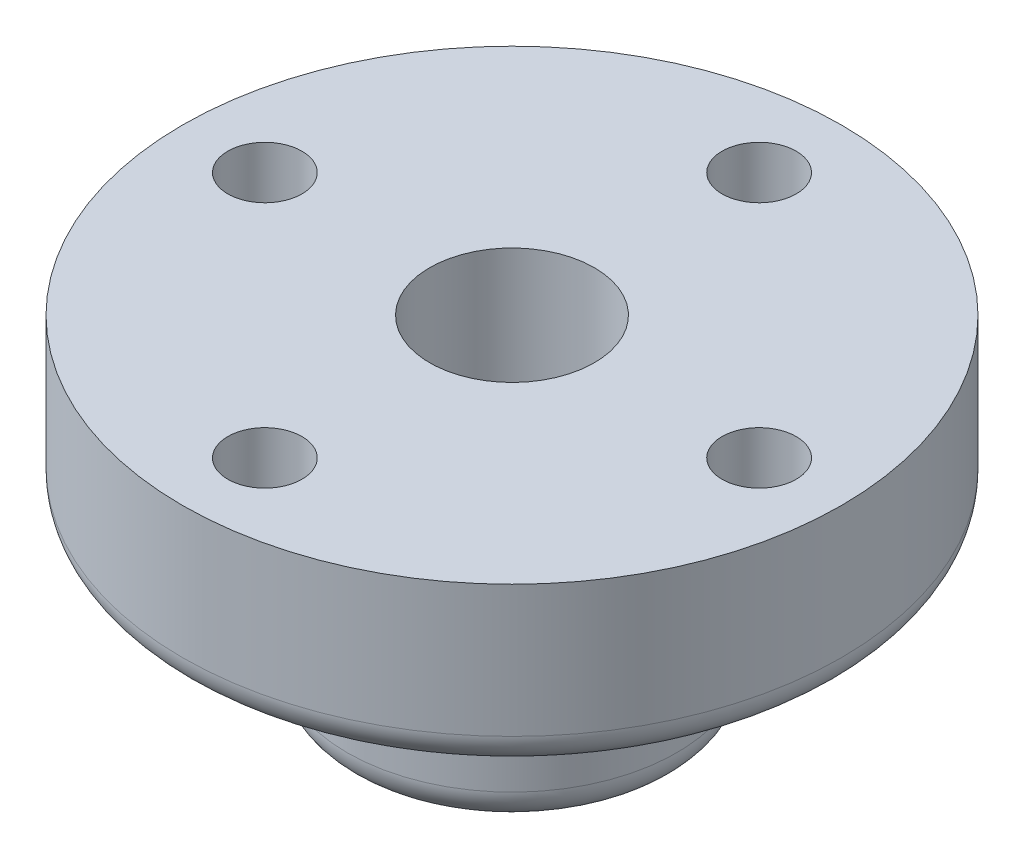
ISO-10303-21;
HEADER;
FILE_DESCRIPTION(('STEP AP214'),'2;1');
FILE_NAME('part.step','',(''),(''),'','','');
FILE_SCHEMA(('AUTOMOTIVE_DESIGN { 1 0 10303 214 1 1 1 1 }'));
ENDSEC;
DATA;
#1=APPLICATION_CONTEXT('core data for automotive mechanical design processes');
#2=APPLICATION_PROTOCOL_DEFINITION('international standard','automotive_design',2000,#1);
#3=PRODUCT_CONTEXT('',#1,'mechanical');
#4=PRODUCT('Part','Part','',(#3));
#5=PRODUCT_RELATED_PRODUCT_CATEGORY('part','',(#4));
#6=PRODUCT_DEFINITION_FORMATION('','',#4);
#7=PRODUCT_DEFINITION_CONTEXT('part definition',#1,'design');
#8=PRODUCT_DEFINITION('design','',#6,#7);
#9=PRODUCT_DEFINITION_SHAPE('','',#8);
#10=(LENGTH_UNIT() NAMED_UNIT(*) SI_UNIT(.MILLI.,.METRE.));
#11=(NAMED_UNIT(*) PLANE_ANGLE_UNIT() SI_UNIT($,.RADIAN.));
#12=(NAMED_UNIT(*) SI_UNIT($,.STERADIAN.) SOLID_ANGLE_UNIT());
#13=UNCERTAINTY_MEASURE_WITH_UNIT(LENGTH_MEASURE(1.E-05),#10,'distance_accuracy_value','');
#14=(GEOMETRIC_REPRESENTATION_CONTEXT(3) GLOBAL_UNCERTAINTY_ASSIGNED_CONTEXT((#13)) GLOBAL_UNIT_ASSIGNED_CONTEXT((#10,
#11,#12)) REPRESENTATION_CONTEXT('',''));
#15=CARTESIAN_POINT('',(0.,0.,0.));
#16=DIRECTION('',(0.,0.,1.));
#17=DIRECTION('',(1.,0.,0.));
#18=AXIS2_PLACEMENT_3D('',#15,#16,#17);
#19=CARTESIAN_POINT('',(0.,254.,0.));
#20=DIRECTION('',(0.,-1.,0.));
#21=DIRECTION('',(0.,0.,-1.));
#22=AXIS2_PLACEMENT_3D('',#19,#20,#21);
#23=CYLINDRICAL_SURFACE('',#22,254.);
#24=CARTESIAN_POINT('',(0.,203.2,0.));
#25=DIRECTION('',(0.,1.,0.));
#26=DIRECTION('',(0.,0.,1.));
#27=AXIS2_PLACEMENT_3D('',#24,#25,#26);
#28=CIRCLE('',#27,254.);
#29=CARTESIAN_POINT('',(0.,203.2,254.));
#30=VERTEX_POINT('',#29);
#31=EDGE_CURVE('E37',#30,#30,#28,.F.);
#32=ORIENTED_EDGE('',*,*,#31,.T.);
#33=EDGE_LOOP('',(#32));
#34=FACE_BOUND('',#33,.T.);
#35=CARTESIAN_POINT('',(0.,50.8,0.));
#36=DIRECTION('',(0.,1.,0.));
#37=DIRECTION('',(0.,0.,1.));
#38=AXIS2_PLACEMENT_3D('',#35,#36,#37);
#39=CIRCLE('',#38,254.);
#40=CARTESIAN_POINT('',(0.,50.8,254.));
#41=VERTEX_POINT('',#40);
#42=EDGE_CURVE('E41',#41,#41,#39,.T.);
#43=ORIENTED_EDGE('',*,*,#42,.T.);
#44=EDGE_LOOP('',(#43));
#45=FACE_BOUND('',#44,.T.);
#46=ADVANCED_FACE('F30',(#34,#45),#23,.T.);
#47=CARTESIAN_POINT('',(0.,0.,0.));
#48=DIRECTION('',(0.,1.,0.));
#49=DIRECTION('',(0.,0.,1.));
#50=AXIS2_PLACEMENT_3D('',#47,#48,#49);
#51=PLANE('',#50);
#52=CARTESIAN_POINT('',(0.,0.,0.));
#53=DIRECTION('',(0.,1.,0.));
#54=DIRECTION('',(0.,0.,1.));
#55=AXIS2_PLACEMENT_3D('',#52,#53,#54);
#56=CIRCLE('',#55,203.2);
#57=CARTESIAN_POINT('',(0.,0.,203.2));
#58=VERTEX_POINT('',#57);
#59=EDGE_CURVE('E10',#58,#58,#56,.F.);
#60=ORIENTED_EDGE('',*,*,#59,.T.);
#61=EDGE_LOOP('',(#60));
#62=FACE_BOUND('',#61,.T.);
#63=CARTESIAN_POINT('',(0.,0.,0.));
#64=DIRECTION('',(0.,-1.,0.));
#65=DIRECTION('',(0.,0.,-1.));
#66=AXIS2_PLACEMENT_3D('',#63,#64,#65);
#67=CIRCLE('',#66,127.);
#68=CARTESIAN_POINT('',(0.,0.,-127.));
#69=VERTEX_POINT('',#68);
#70=EDGE_CURVE('E60',#69,#69,#67,.T.);
#71=ORIENTED_EDGE('',*,*,#70,.F.);
#72=EDGE_LOOP('',(#71));
#73=FACE_BOUND('',#72,.T.);
#74=ADVANCED_FACE('F128',(#62,#73),#51,.F.);
#75=CARTESIAN_POINT('',(0.,508.,0.));
#76=DIRECTION('',(0.,-1.,0.));
#77=DIRECTION('',(0.,0.,-1.));
#78=AXIS2_PLACEMENT_3D('',#75,#76,#77);
#79=CYLINDRICAL_SURFACE('',#78,508.);
#80=CARTESIAN_POINT('',(0.,304.8,0.));
#81=DIRECTION('',(0.,1.,0.));
#82=DIRECTION('',(0.,0.,1.));
#83=AXIS2_PLACEMENT_3D('',#80,#81,#82);
#84=CIRCLE('',#83,508.);
#85=CARTESIAN_POINT('',(0.,304.8,508.));
#86=VERTEX_POINT('',#85);
#87=EDGE_CURVE('E53',#86,#86,#84,.T.);
#88=ORIENTED_EDGE('',*,*,#87,.T.);
#89=EDGE_LOOP('',(#88));
#90=FACE_BOUND('',#89,.T.);
#91=CARTESIAN_POINT('',(0.,508.,0.));
#92=DIRECTION('',(0.,1.,0.));
#93=DIRECTION('',(0.,0.,1.));
#94=AXIS2_PLACEMENT_3D('',#91,#92,#93);
#95=CIRCLE('',#94,508.);
#96=CARTESIAN_POINT('',(0.,508.,508.));
#97=VERTEX_POINT('',#96);
#98=EDGE_CURVE('E56',#97,#97,#95,.T.);
#99=ORIENTED_EDGE('',*,*,#98,.F.);
#100=EDGE_LOOP('',(#99));
#101=FACE_BOUND('',#100,.T.);
#102=ADVANCED_FACE('F133',(#90,#101),#79,.T.);
#103=CARTESIAN_POINT('',(0.,508.,0.));
#104=DIRECTION('',(0.,1.,0.));
#105=DIRECTION('',(0.,0.,1.));
#106=AXIS2_PLACEMENT_3D('',#103,#104,#105);
#107=PLANE('',#106);
#108=CARTESIAN_POINT('',(381.,508.,0.));
#109=DIRECTION('',(0.,-1.,0.));
#110=DIRECTION('',(0.,0.,-1.));
#111=AXIS2_PLACEMENT_3D('',#108,#109,#110);
#112=CIRCLE('',#111,57.15);
#113=CARTESIAN_POINT('',(381.,508.,-57.15));
#114=VERTEX_POINT('',#113);
#115=EDGE_CURVE('E69',#114,#114,#112,.T.);
#116=ORIENTED_EDGE('',*,*,#115,.T.);
#117=EDGE_LOOP('',(#116));
#118=FACE_BOUND('',#117,.T.);
#119=CARTESIAN_POINT('',(0.,508.,381.));
#120=DIRECTION('',(0.,-1.,0.));
#121=DIRECTION('',(0.,0.,-1.));
#122=AXIS2_PLACEMENT_3D('',#119,#120,#121);
#123=CIRCLE('',#122,57.15);
#124=CARTESIAN_POINT('',(0.,508.,323.85));
#125=VERTEX_POINT('',#124);
#126=EDGE_CURVE('E81',#125,#125,#123,.T.);
#127=ORIENTED_EDGE('',*,*,#126,.T.);
#128=EDGE_LOOP('',(#127));
#129=FACE_BOUND('',#128,.T.);
#130=CARTESIAN_POINT('',(-381.,508.,0.));
#131=DIRECTION('',(0.,-1.,0.));
#132=DIRECTION('',(0.,0.,-1.));
#133=AXIS2_PLACEMENT_3D('',#130,#131,#132);
#134=CIRCLE('',#133,57.15);
#135=CARTESIAN_POINT('',(-381.,508.,-57.15));
#136=VERTEX_POINT('',#135);
#137=EDGE_CURVE('E75',#136,#136,#134,.T.);
#138=ORIENTED_EDGE('',*,*,#137,.T.);
#139=EDGE_LOOP('',(#138));
#140=FACE_BOUND('',#139,.T.);
#141=CARTESIAN_POINT('',(0.,508.,-381.));
#142=DIRECTION('',(0.,-1.,0.));
#143=DIRECTION('',(0.,0.,-1.));
#144=AXIS2_PLACEMENT_3D('',#141,#142,#143);
#145=CIRCLE('',#144,57.15);
#146=CARTESIAN_POINT('',(0.,508.,-438.15));
#147=VERTEX_POINT('',#146);
#148=EDGE_CURVE('E63',#147,#147,#145,.T.);
#149=ORIENTED_EDGE('',*,*,#148,.T.);
#150=EDGE_LOOP('',(#149));
#151=FACE_BOUND('',#150,.T.);
#152=CARTESIAN_POINT('',(0.,508.,0.));
#153=DIRECTION('',(0.,-1.,0.));
#154=DIRECTION('',(0.,0.,-1.));
#155=AXIS2_PLACEMENT_3D('',#152,#153,#154);
#156=CIRCLE('',#155,127.);
#157=CARTESIAN_POINT('',(0.,508.,-127.));
#158=VERTEX_POINT('',#157);
#159=EDGE_CURVE('E59',#158,#158,#156,.T.);
#160=ORIENTED_EDGE('',*,*,#159,.T.);
#161=EDGE_LOOP('',(#160));
#162=FACE_BOUND('',#161,.T.);
#163=ORIENTED_EDGE('',*,*,#98,.T.);
#164=EDGE_LOOP('',(#163));
#165=FACE_BOUND('',#164,.T.);
#166=ADVANCED_FACE('F90',(#118,#129,#140,#151,#162,#165),#107,.T.);
#167=CARTESIAN_POINT('',(0.,254.,0.));
#168=DIRECTION('',(0.,1.,0.));
#169=DIRECTION('',(0.,0.,1.));
#170=AXIS2_PLACEMENT_3D('',#167,#168,#169);
#171=PLANE('',#170);
#172=CARTESIAN_POINT('',(0.,254.,0.));
#173=DIRECTION('',(0.,1.,0.));
#174=DIRECTION('',(0.,0.,1.));
#175=AXIS2_PLACEMENT_3D('',#172,#173,#174);
#176=CIRCLE('',#175,457.2);
#177=CARTESIAN_POINT('',(0.,254.,457.2));
#178=VERTEX_POINT('',#177);
#179=EDGE_CURVE('E45',#178,#178,#176,.F.);
#180=ORIENTED_EDGE('',*,*,#179,.T.);
#181=EDGE_LOOP('',(#180));
#182=FACE_BOUND('',#181,.T.);
#183=CARTESIAN_POINT('',(0.,254.,0.));
#184=DIRECTION('',(0.,1.,0.));
#185=DIRECTION('',(0.,0.,1.));
#186=AXIS2_PLACEMENT_3D('',#183,#184,#185);
#187=CIRCLE('',#186,304.8);
#188=CARTESIAN_POINT('',(0.,254.,304.8));
#189=VERTEX_POINT('',#188);
#190=EDGE_CURVE('E50',#189,#189,#187,.T.);
#191=ORIENTED_EDGE('',*,*,#190,.T.);
#192=EDGE_LOOP('',(#191));
#193=FACE_BOUND('',#192,.T.);
#194=CARTESIAN_POINT('',(381.,254.,0.));
#195=DIRECTION('',(0.,-1.,0.));
#196=DIRECTION('',(0.,0.,-1.));
#197=AXIS2_PLACEMENT_3D('',#194,#195,#196);
#198=CIRCLE('',#197,57.15);
#199=CARTESIAN_POINT('',(381.,254.,-57.15));
#200=VERTEX_POINT('',#199);
#201=EDGE_CURVE('E84',#200,#200,#198,.T.);
#202=ORIENTED_EDGE('',*,*,#201,.F.);
#203=EDGE_LOOP('',(#202));
#204=FACE_BOUND('',#203,.T.);
#205=CARTESIAN_POINT('',(0.,254.,381.));
#206=DIRECTION('',(0.,-1.,0.));
#207=DIRECTION('',(0.,0.,-1.));
#208=AXIS2_PLACEMENT_3D('',#205,#206,#207);
#209=CIRCLE('',#208,57.15);
#210=CARTESIAN_POINT('',(0.,254.,323.85));
#211=VERTEX_POINT('',#210);
#212=EDGE_CURVE('E78',#211,#211,#209,.T.);
#213=ORIENTED_EDGE('',*,*,#212,.F.);
#214=EDGE_LOOP('',(#213));
#215=FACE_BOUND('',#214,.T.);
#216=CARTESIAN_POINT('',(-381.,254.,0.));
#217=DIRECTION('',(0.,-1.,0.));
#218=DIRECTION('',(0.,0.,-1.));
#219=AXIS2_PLACEMENT_3D('',#216,#217,#218);
#220=CIRCLE('',#219,57.15);
#221=CARTESIAN_POINT('',(-381.,254.,-57.15));
#222=VERTEX_POINT('',#221);
#223=EDGE_CURVE('E72',#222,#222,#220,.T.);
#224=ORIENTED_EDGE('',*,*,#223,.F.);
#225=EDGE_LOOP('',(#224));
#226=FACE_BOUND('',#225,.T.);
#227=CARTESIAN_POINT('',(0.,254.,-381.));
#228=DIRECTION('',(0.,-1.,0.));
#229=DIRECTION('',(0.,0.,-1.));
#230=AXIS2_PLACEMENT_3D('',#227,#228,#229);
#231=CIRCLE('',#230,57.15);
#232=CARTESIAN_POINT('',(0.,254.,-438.15));
#233=VERTEX_POINT('',#232);
#234=EDGE_CURVE('E66',#233,#233,#231,.T.);
#235=ORIENTED_EDGE('',*,*,#234,.F.);
#236=EDGE_LOOP('',(#235));
#237=FACE_BOUND('',#236,.T.);
#238=ADVANCED_FACE('F101',(#182,#193,#204,#215,#226,#237),#171,.F.);
#239=CARTESIAN_POINT('',(0.,508.,0.));
#240=DIRECTION('',(0.,-1.,0.));
#241=DIRECTION('',(0.,0.,-1.));
#242=AXIS2_PLACEMENT_3D('',#239,#240,#241);
#243=CYLINDRICAL_SURFACE('',#242,127.);
#244=ORIENTED_EDGE('',*,*,#159,.F.);
#245=EDGE_LOOP('',(#244));
#246=FACE_BOUND('',#245,.T.);
#247=ORIENTED_EDGE('',*,*,#70,.T.);
#248=EDGE_LOOP('',(#247));
#249=FACE_BOUND('',#248,.T.);
#250=ADVANCED_FACE('F104',(#246,#249),#243,.F.);
#251=CARTESIAN_POINT('',(0.,508.,-381.));
#252=DIRECTION('',(0.,-1.,0.));
#253=DIRECTION('',(0.,0.,-1.));
#254=AXIS2_PLACEMENT_3D('',#251,#252,#253);
#255=CYLINDRICAL_SURFACE('',#254,57.15);
#256=ORIENTED_EDGE('',*,*,#148,.F.);
#257=EDGE_LOOP('',(#256));
#258=FACE_BOUND('',#257,.T.);
#259=ORIENTED_EDGE('',*,*,#234,.T.);
#260=EDGE_LOOP('',(#259));
#261=FACE_BOUND('',#260,.T.);
#262=ADVANCED_FACE('F113',(#258,#261),#255,.F.);
#263=CARTESIAN_POINT('',(-381.,508.,0.));
#264=DIRECTION('',(0.,-1.,0.));
#265=DIRECTION('',(0.,0.,-1.));
#266=AXIS2_PLACEMENT_3D('',#263,#264,#265);
#267=CYLINDRICAL_SURFACE('',#266,57.15);
#268=ORIENTED_EDGE('',*,*,#137,.F.);
#269=EDGE_LOOP('',(#268));
#270=FACE_BOUND('',#269,.T.);
#271=ORIENTED_EDGE('',*,*,#223,.T.);
#272=EDGE_LOOP('',(#271));
#273=FACE_BOUND('',#272,.T.);
#274=ADVANCED_FACE('F115',(#270,#273),#267,.F.);
#275=CARTESIAN_POINT('',(0.,508.,381.));
#276=DIRECTION('',(0.,-1.,0.));
#277=DIRECTION('',(0.,0.,-1.));
#278=AXIS2_PLACEMENT_3D('',#275,#276,#277);
#279=CYLINDRICAL_SURFACE('',#278,57.15);
#280=ORIENTED_EDGE('',*,*,#126,.F.);
#281=EDGE_LOOP('',(#280));
#282=FACE_BOUND('',#281,.T.);
#283=ORIENTED_EDGE('',*,*,#212,.T.);
#284=EDGE_LOOP('',(#283));
#285=FACE_BOUND('',#284,.T.);
#286=ADVANCED_FACE('F97',(#282,#285),#279,.F.);
#287=CARTESIAN_POINT('',(381.,508.,0.));
#288=DIRECTION('',(0.,-1.,0.));
#289=DIRECTION('',(0.,0.,-1.));
#290=AXIS2_PLACEMENT_3D('',#287,#288,#289);
#291=CYLINDRICAL_SURFACE('',#290,57.15);
#292=ORIENTED_EDGE('',*,*,#115,.F.);
#293=EDGE_LOOP('',(#292));
#294=FACE_BOUND('',#293,.T.);
#295=ORIENTED_EDGE('',*,*,#201,.T.);
#296=EDGE_LOOP('',(#295));
#297=FACE_BOUND('',#296,.T.);
#298=ADVANCED_FACE('F93',(#294,#297),#291,.F.);
#299=CARTESIAN_POINT('',(0.,304.8,0.));
#300=DIRECTION('',(0.,1.,0.));
#301=DIRECTION('',(0.,0.,1.));
#302=AXIS2_PLACEMENT_3D('',#299,#300,#301);
#303=TOROIDAL_SURFACE('',#302,457.2,50.8);
#304=ORIENTED_EDGE('',*,*,#179,.F.);
#305=EDGE_LOOP('',(#304));
#306=FACE_BOUND('',#305,.T.);
#307=ORIENTED_EDGE('',*,*,#87,.F.);
#308=EDGE_LOOP('',(#307));
#309=FACE_BOUND('',#308,.T.);
#310=ADVANCED_FACE('F96',(#306,#309),#303,.T.);
#311=CARTESIAN_POINT('',(0.,203.2,0.));
#312=DIRECTION('',(0.,1.,0.));
#313=DIRECTION('',(0.,0.,1.));
#314=AXIS2_PLACEMENT_3D('',#311,#312,#313);
#315=TOROIDAL_SURFACE('',#314,304.8,50.8);
#316=ORIENTED_EDGE('',*,*,#31,.F.);
#317=EDGE_LOOP('',(#316));
#318=FACE_BOUND('',#317,.T.);
#319=ORIENTED_EDGE('',*,*,#190,.F.);
#320=EDGE_LOOP('',(#319));
#321=FACE_BOUND('',#320,.T.);
#322=ADVANCED_FACE('F139',(#318,#321),#315,.F.);
#323=CARTESIAN_POINT('',(0.,50.8,0.));
#324=DIRECTION('',(0.,1.,0.));
#325=DIRECTION('',(0.,0.,1.));
#326=AXIS2_PLACEMENT_3D('',#323,#324,#325);
#327=TOROIDAL_SURFACE('',#326,203.2,50.8);
#328=ORIENTED_EDGE('',*,*,#59,.F.);
#329=EDGE_LOOP('',(#328));
#330=FACE_BOUND('',#329,.T.);
#331=ORIENTED_EDGE('',*,*,#42,.F.);
#332=EDGE_LOOP('',(#331));
#333=FACE_BOUND('',#332,.T.);
#334=ADVANCED_FACE('F32',(#330,#333),#327,.T.);
#335=CLOSED_SHELL('',(#46,#74,#102,#166,#238,#250,#262,#274,#286,#298,#310,#322,#334));
#336=MANIFOLD_SOLID_BREP('B2',#335);
#337=ADVANCED_BREP_SHAPE_REPRESENTATION('',(#18,#336),#14);
#338=SHAPE_DEFINITION_REPRESENTATION(#9,#337);
ENDSEC;
END-ISO-10303-21;
